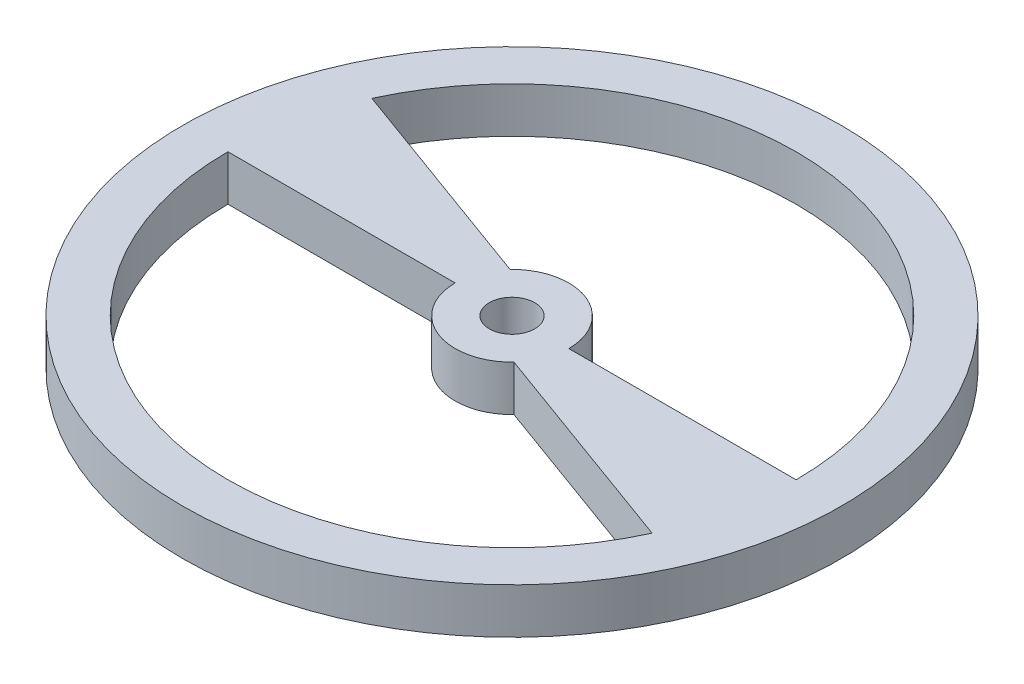
ISO-10303-21;
HEADER;
FILE_DESCRIPTION(('STEP AP214'),'2;1');
FILE_NAME('part.step','',(''),(''),'','','');
FILE_SCHEMA(('AUTOMOTIVE_DESIGN { 1 0 10303 214 1 1 1 1 }'));
ENDSEC;
DATA;
#1=APPLICATION_CONTEXT('core data for automotive mechanical design processes');
#2=APPLICATION_PROTOCOL_DEFINITION('international standard','automotive_design',2000,#1);
#3=PRODUCT_CONTEXT('',#1,'mechanical');
#4=PRODUCT('Part','Part','',(#3));
#5=PRODUCT_RELATED_PRODUCT_CATEGORY('part','',(#4));
#6=PRODUCT_DEFINITION_FORMATION('','',#4);
#7=PRODUCT_DEFINITION_CONTEXT('part definition',#1,'design');
#8=PRODUCT_DEFINITION('design','',#6,#7);
#9=PRODUCT_DEFINITION_SHAPE('','',#8);
#10=(LENGTH_UNIT() NAMED_UNIT(*) SI_UNIT(.MILLI.,.METRE.));
#11=(NAMED_UNIT(*) PLANE_ANGLE_UNIT() SI_UNIT($,.RADIAN.));
#12=(NAMED_UNIT(*) SI_UNIT($,.STERADIAN.) SOLID_ANGLE_UNIT());
#13=UNCERTAINTY_MEASURE_WITH_UNIT(LENGTH_MEASURE(1.E-05),#10,'distance_accuracy_value','');
#14=(GEOMETRIC_REPRESENTATION_CONTEXT(3) GLOBAL_UNCERTAINTY_ASSIGNED_CONTEXT((#13)) GLOBAL_UNIT_ASSIGNED_CONTEXT((#10,
#11,#12)) REPRESENTATION_CONTEXT('',''));
#15=CARTESIAN_POINT('',(0.,0.,0.));
#16=DIRECTION('',(0.,0.,1.));
#17=DIRECTION('',(1.,0.,0.));
#18=AXIS2_PLACEMENT_3D('',#15,#16,#17);
#19=CARTESIAN_POINT('',(0.,2.,0.));
#20=DIRECTION('',(0.,1.,0.));
#21=DIRECTION('',(0.,0.,1.));
#22=AXIS2_PLACEMENT_3D('',#19,#20,#21);
#23=PLANE('',#22);
#24=CARTESIAN_POINT('',(0.,2.,0.));
#25=DIRECTION('',(0.,1.,0.));
#26=DIRECTION('',(0.,0.,1.));
#27=AXIS2_PLACEMENT_3D('',#24,#25,#26);
#28=CIRCLE('',#27,14.5);
#29=CARTESIAN_POINT('',(0.,2.,14.5));
#30=VERTEX_POINT('',#29);
#31=EDGE_CURVE('E11',#30,#30,#28,.T.);
#32=ORIENTED_EDGE('',*,*,#31,.T.);
#33=EDGE_LOOP('',(#32));
#34=FACE_BOUND('',#33,.T.);
#35=CARTESIAN_POINT('',(0.,2.,0.));
#36=DIRECTION('',(0.,1.,0.));
#37=DIRECTION('',(0.,0.,1.));
#38=AXIS2_PLACEMENT_3D('',#35,#36,#37);
#39=CIRCLE('',#38,1.);
#40=CARTESIAN_POINT('',(0.,2.,1.));
#41=VERTEX_POINT('',#40);
#42=EDGE_CURVE('E171',#41,#41,#39,.T.);
#43=ORIENTED_EDGE('',*,*,#42,.F.);
#44=EDGE_LOOP('',(#43));
#45=FACE_BOUND('',#44,.T.);
#46=DIRECTION('',(-1.,0.,0.));
#47=VECTOR('',#46,1.);
#48=CARTESIAN_POINT('',(-2.5,2.,0.));
#49=LINE('',#48,#47);
#50=CARTESIAN_POINT('',(-2.5,2.,0.));
#51=VERTEX_POINT('',#50);
#52=CARTESIAN_POINT('',(-12.5,2.,0.));
#53=VERTEX_POINT('',#52);
#54=EDGE_CURVE('E142',#51,#53,#49,.T.);
#55=ORIENTED_EDGE('',*,*,#54,.F.);
#56=CARTESIAN_POINT('',(0.,2.,0.));
#57=DIRECTION('',(0.,-1.,0.));
#58=DIRECTION('',(0.,0.,1.));
#59=AXIS2_PLACEMENT_3D('',#56,#57,#58);
#60=CIRCLE('',#59,2.5);
#61=CARTESIAN_POINT('',(1.81108613904576,2.,1.72335921878067));
#62=VERTEX_POINT('',#61);
#63=EDGE_CURVE('E140',#62,#51,#60,.T.);
#64=ORIENTED_EDGE('',*,*,#63,.F.);
#65=DIRECTION('',(-0.939692620785908,0.,-0.342020143325669));
#66=VECTOR('',#65,1.);
#67=CARTESIAN_POINT('',(1.81108613904576,2.,1.72335921878067));
#68=LINE('',#67,#66);
#69=CARTESIAN_POINT('',(11.3664895781167,2.,5.20124164700741));
#70=VERTEX_POINT('',#69);
#71=EDGE_CURVE('E148',#70,#62,#68,.T.);
#72=ORIENTED_EDGE('',*,*,#71,.F.);
#73=CARTESIAN_POINT('',(0.,2.,0.));
#74=DIRECTION('',(0.,1.,0.));
#75=DIRECTION('',(0.,0.,1.));
#76=AXIS2_PLACEMENT_3D('',#73,#74,#75);
#77=CIRCLE('',#76,12.5);
#78=EDGE_CURVE('E145',#53,#70,#77,.T.);
#79=ORIENTED_EDGE('',*,*,#78,.F.);
#80=EDGE_LOOP('',(#55,#64,#72,#79));
#81=FACE_BOUND('',#80,.T.);
#82=DIRECTION('',(0.939692620785911,0.,0.342020143325663));
#83=VECTOR('',#82,1.);
#84=CARTESIAN_POINT('',(-11.3664895781167,2.,-5.20124164700733));
#85=LINE('',#84,#83);
#86=CARTESIAN_POINT('',(-11.3664895781167,2.,-5.20124164700733));
#87=VERTEX_POINT('',#86);
#88=CARTESIAN_POINT('',(-1.81108613904577,2.,-1.72335921878066));
#89=VERTEX_POINT('',#88);
#90=EDGE_CURVE('E112',#87,#89,#85,.T.);
#91=ORIENTED_EDGE('',*,*,#90,.F.);
#92=CARTESIAN_POINT('',(0.,2.,0.));
#93=DIRECTION('',(0.,1.,0.));
#94=DIRECTION('',(0.,0.,1.));
#95=AXIS2_PLACEMENT_3D('',#92,#93,#94);
#96=CIRCLE('',#95,12.5);
#97=CARTESIAN_POINT('',(12.5,2.,0.));
#98=VERTEX_POINT('',#97);
#99=EDGE_CURVE('E104',#98,#87,#96,.T.);
#100=ORIENTED_EDGE('',*,*,#99,.F.);
#101=DIRECTION('',(1.,0.,0.));
#102=VECTOR('',#101,1.);
#103=CARTESIAN_POINT('',(2.5,2.,0.));
#104=LINE('',#103,#102);
#105=CARTESIAN_POINT('',(2.5,2.,0.));
#106=VERTEX_POINT('',#105);
#107=EDGE_CURVE('E126',#106,#98,#104,.T.);
#108=ORIENTED_EDGE('',*,*,#107,.F.);
#109=CARTESIAN_POINT('',(0.,2.,0.));
#110=DIRECTION('',(0.,-1.,0.));
#111=DIRECTION('',(0.,0.,1.));
#112=AXIS2_PLACEMENT_3D('',#109,#110,#111);
#113=CIRCLE('',#112,2.5);
#114=EDGE_CURVE('E124',#89,#106,#113,.T.);
#115=ORIENTED_EDGE('',*,*,#114,.F.);
#116=EDGE_LOOP('',(#91,#100,#108,#115));
#117=FACE_BOUND('',#116,.T.);
#118=ADVANCED_FACE('F39',(#34,#45,#81,#117),#23,.T.);
#119=CARTESIAN_POINT('',(0.,0.,0.));
#120=DIRECTION('',(0.,1.,0.));
#121=DIRECTION('',(0.,0.,1.));
#122=AXIS2_PLACEMENT_3D('',#119,#120,#121);
#123=PLANE('',#122);
#124=CARTESIAN_POINT('',(0.,0.,0.));
#125=DIRECTION('',(0.,-1.,0.));
#126=DIRECTION('',(0.,0.,1.));
#127=AXIS2_PLACEMENT_3D('',#124,#125,#126);
#128=CIRCLE('',#127,2.5);
#129=CARTESIAN_POINT('',(1.81108613904576,0.,1.72335921878067));
#130=VERTEX_POINT('',#129);
#131=CARTESIAN_POINT('',(-2.5,0.,0.));
#132=VERTEX_POINT('',#131);
#133=EDGE_CURVE('E120',#130,#132,#128,.T.);
#134=ORIENTED_EDGE('',*,*,#133,.T.);
#135=DIRECTION('',(-1.,0.,0.));
#136=VECTOR('',#135,1.);
#137=CARTESIAN_POINT('',(-2.5,0.,0.));
#138=LINE('',#137,#136);
#139=CARTESIAN_POINT('',(-12.5,0.,0.));
#140=VERTEX_POINT('',#139);
#141=EDGE_CURVE('E153',#132,#140,#138,.T.);
#142=ORIENTED_EDGE('',*,*,#141,.T.);
#143=CARTESIAN_POINT('',(0.,0.,0.));
#144=DIRECTION('',(0.,1.,0.));
#145=DIRECTION('',(0.,0.,1.));
#146=AXIS2_PLACEMENT_3D('',#143,#144,#145);
#147=CIRCLE('',#146,12.5);
#148=CARTESIAN_POINT('',(11.3664895781167,0.,5.2012416470074));
#149=VERTEX_POINT('',#148);
#150=EDGE_CURVE('E156',#140,#149,#147,.T.);
#151=ORIENTED_EDGE('',*,*,#150,.T.);
#152=DIRECTION('',(-0.939692620785908,0.,-0.342020143325669));
#153=VECTOR('',#152,1.);
#154=CARTESIAN_POINT('',(1.81108613904576,0.,1.72335921878067));
#155=LINE('',#154,#153);
#156=EDGE_CURVE('E143',#149,#130,#155,.T.);
#157=ORIENTED_EDGE('',*,*,#156,.T.);
#158=EDGE_LOOP('',(#134,#142,#151,#157));
#159=FACE_BOUND('',#158,.T.);
#160=CARTESIAN_POINT('',(0.,0.,0.));
#161=DIRECTION('',(0.,1.,0.));
#162=DIRECTION('',(0.,0.,1.));
#163=AXIS2_PLACEMENT_3D('',#160,#161,#162);
#164=CIRCLE('',#163,14.5);
#165=CARTESIAN_POINT('',(0.,0.,14.5));
#166=VERTEX_POINT('',#165);
#167=EDGE_CURVE('E43',#166,#166,#164,.T.);
#168=ORIENTED_EDGE('',*,*,#167,.F.);
#169=EDGE_LOOP('',(#168));
#170=FACE_BOUND('',#169,.T.);
#171=CARTESIAN_POINT('',(0.,0.,0.));
#172=DIRECTION('',(0.,1.,0.));
#173=DIRECTION('',(0.,0.,1.));
#174=AXIS2_PLACEMENT_3D('',#171,#172,#173);
#175=CIRCLE('',#174,1.);
#176=CARTESIAN_POINT('',(0.,0.,1.));
#177=VERTEX_POINT('',#176);
#178=EDGE_CURVE('E170',#177,#177,#175,.T.);
#179=ORIENTED_EDGE('',*,*,#178,.T.);
#180=EDGE_LOOP('',(#179));
#181=FACE_BOUND('',#180,.T.);
#182=CARTESIAN_POINT('',(0.,0.,0.));
#183=DIRECTION('',(0.,1.,0.));
#184=DIRECTION('',(0.,0.,1.));
#185=AXIS2_PLACEMENT_3D('',#182,#183,#184);
#186=CIRCLE('',#185,12.5);
#187=CARTESIAN_POINT('',(12.5,0.,0.));
#188=VERTEX_POINT('',#187);
#189=CARTESIAN_POINT('',(-11.3664895781167,0.,-5.20124164700733));
#190=VERTEX_POINT('',#189);
#191=EDGE_CURVE('E62',#188,#190,#186,.T.);
#192=ORIENTED_EDGE('',*,*,#191,.T.);
#193=DIRECTION('',(0.939692620785911,0.,0.342020143325663));
#194=VECTOR('',#193,1.);
#195=CARTESIAN_POINT('',(-11.3664895781167,0.,-5.20124164700733));
#196=LINE('',#195,#194);
#197=CARTESIAN_POINT('',(-1.81108613904577,0.,-1.72335921878066));
#198=VERTEX_POINT('',#197);
#199=EDGE_CURVE('E119',#190,#198,#196,.T.);
#200=ORIENTED_EDGE('',*,*,#199,.T.);
#201=CARTESIAN_POINT('',(0.,0.,0.));
#202=DIRECTION('',(0.,-1.,0.));
#203=DIRECTION('',(0.,0.,1.));
#204=AXIS2_PLACEMENT_3D('',#201,#202,#203);
#205=CIRCLE('',#204,2.5);
#206=CARTESIAN_POINT('',(2.5,0.,0.));
#207=VERTEX_POINT('',#206);
#208=EDGE_CURVE('E132',#198,#207,#205,.T.);
#209=ORIENTED_EDGE('',*,*,#208,.T.);
#210=DIRECTION('',(1.,0.,0.));
#211=VECTOR('',#210,1.);
#212=CARTESIAN_POINT('',(2.5,0.,0.));
#213=LINE('',#212,#211);
#214=EDGE_CURVE('E113',#207,#188,#213,.T.);
#215=ORIENTED_EDGE('',*,*,#214,.T.);
#216=EDGE_LOOP('',(#192,#200,#209,#215));
#217=FACE_BOUND('',#216,.T.);
#218=ADVANCED_FACE('F177',(#159,#170,#181,#217),#123,.F.);
#219=CARTESIAN_POINT('',(0.,2.,0.));
#220=DIRECTION('',(0.,-1.,0.));
#221=DIRECTION('',(0.,0.,-1.));
#222=AXIS2_PLACEMENT_3D('',#219,#220,#221);
#223=CYLINDRICAL_SURFACE('',#222,14.5);
#224=ORIENTED_EDGE('',*,*,#31,.F.);
#225=EDGE_LOOP('',(#224));
#226=FACE_BOUND('',#225,.T.);
#227=ORIENTED_EDGE('',*,*,#167,.T.);
#228=EDGE_LOOP('',(#227));
#229=FACE_BOUND('',#228,.T.);
#230=ADVANCED_FACE('F41',(#226,#229),#223,.T.);
#231=CARTESIAN_POINT('',(0.,2.,0.));
#232=DIRECTION('',(0.,-1.,0.));
#233=DIRECTION('',(0.,0.,-1.));
#234=AXIS2_PLACEMENT_3D('',#231,#232,#233);
#235=CYLINDRICAL_SURFACE('',#234,1.);
#236=ORIENTED_EDGE('',*,*,#42,.T.);
#237=EDGE_LOOP('',(#236));
#238=FACE_BOUND('',#237,.T.);
#239=ORIENTED_EDGE('',*,*,#178,.F.);
#240=EDGE_LOOP('',(#239));
#241=FACE_BOUND('',#240,.T.);
#242=ADVANCED_FACE('F180',(#238,#241),#235,.F.);
#243=CARTESIAN_POINT('',(0.,2.,0.));
#244=DIRECTION('',(0.,-1.,0.));
#245=DIRECTION('',(0.,0.,-1.));
#246=AXIS2_PLACEMENT_3D('',#243,#244,#245);
#247=CYLINDRICAL_SURFACE('',#246,2.5);
#248=ORIENTED_EDGE('',*,*,#133,.F.);
#249=DIRECTION('',(0.,-1.,0.));
#250=VECTOR('',#249,1.);
#251=CARTESIAN_POINT('',(1.81108613904576,2.,1.72335921878067));
#252=LINE('',#251,#250);
#253=EDGE_CURVE('E150',#62,#130,#252,.T.);
#254=ORIENTED_EDGE('',*,*,#253,.F.);
#255=ORIENTED_EDGE('',*,*,#63,.T.);
#256=DIRECTION('',(0.,-1.,0.));
#257=VECTOR('',#256,1.);
#258=CARTESIAN_POINT('',(-2.5,2.,0.));
#259=LINE('',#258,#257);
#260=EDGE_CURVE('E167',#51,#132,#259,.T.);
#261=ORIENTED_EDGE('',*,*,#260,.T.);
#262=EDGE_LOOP('',(#248,#254,#255,#261));
#263=FACE_BOUND('',#262,.T.);
#264=ADVANCED_FACE('F182',(#263),#247,.T.);
#265=CARTESIAN_POINT('',(-2.5,2.,0.));
#266=DIRECTION('',(0.,0.,1.));
#267=DIRECTION('',(1.,0.,0.));
#268=AXIS2_PLACEMENT_3D('',#265,#266,#267);
#269=PLANE('',#268);
#270=ORIENTED_EDGE('',*,*,#141,.F.);
#271=ORIENTED_EDGE('',*,*,#260,.F.);
#272=ORIENTED_EDGE('',*,*,#54,.T.);
#273=DIRECTION('',(0.,-1.,0.));
#274=VECTOR('',#273,1.);
#275=CARTESIAN_POINT('',(-12.5,2.,0.));
#276=LINE('',#275,#274);
#277=EDGE_CURVE('E165',#53,#140,#276,.T.);
#278=ORIENTED_EDGE('',*,*,#277,.T.);
#279=EDGE_LOOP('',(#270,#271,#272,#278));
#280=FACE_BOUND('',#279,.T.);
#281=ADVANCED_FACE('F189',(#280),#269,.T.);
#282=CARTESIAN_POINT('',(0.,2.,0.));
#283=DIRECTION('',(0.,-1.,0.));
#284=DIRECTION('',(0.,0.,-1.));
#285=AXIS2_PLACEMENT_3D('',#282,#283,#284);
#286=CYLINDRICAL_SURFACE('',#285,12.5);
#287=ORIENTED_EDGE('',*,*,#150,.F.);
#288=ORIENTED_EDGE('',*,*,#277,.F.);
#289=ORIENTED_EDGE('',*,*,#78,.T.);
#290=DIRECTION('',(0.,-1.,0.));
#291=VECTOR('',#290,1.);
#292=CARTESIAN_POINT('',(11.3664895781167,2.,5.2012416470074));
#293=LINE('',#292,#291);
#294=EDGE_CURVE('E163',#70,#149,#293,.T.);
#295=ORIENTED_EDGE('',*,*,#294,.T.);
#296=EDGE_LOOP('',(#287,#288,#289,#295));
#297=FACE_BOUND('',#296,.T.);
#298=ADVANCED_FACE('F213',(#297),#286,.F.);
#299=CARTESIAN_POINT('',(1.81108613904576,2.,1.72335921878067));
#300=DIRECTION('',(-0.342020143325669,0.,0.939692620785908));
#301=DIRECTION('',(0.939692620785908,0.,0.342020143325669));
#302=AXIS2_PLACEMENT_3D('',#299,#300,#301);
#303=PLANE('',#302);
#304=ORIENTED_EDGE('',*,*,#156,.F.);
#305=ORIENTED_EDGE('',*,*,#294,.F.);
#306=ORIENTED_EDGE('',*,*,#71,.T.);
#307=ORIENTED_EDGE('',*,*,#253,.T.);
#308=EDGE_LOOP('',(#304,#305,#306,#307));
#309=FACE_BOUND('',#308,.T.);
#310=ADVANCED_FACE('F218',(#309),#303,.T.);
#311=CARTESIAN_POINT('',(0.,2.,0.));
#312=DIRECTION('',(0.,-1.,0.));
#313=DIRECTION('',(0.,0.,-1.));
#314=AXIS2_PLACEMENT_3D('',#311,#312,#313);
#315=CYLINDRICAL_SURFACE('',#314,12.5);
#316=ORIENTED_EDGE('',*,*,#191,.F.);
#317=DIRECTION('',(0.,-1.,0.));
#318=VECTOR('',#317,1.);
#319=CARTESIAN_POINT('',(12.5,2.,0.));
#320=LINE('',#319,#318);
#321=EDGE_CURVE('E108',#98,#188,#320,.T.);
#322=ORIENTED_EDGE('',*,*,#321,.F.);
#323=ORIENTED_EDGE('',*,*,#99,.T.);
#324=DIRECTION('',(0.,-1.,0.));
#325=VECTOR('',#324,1.);
#326=CARTESIAN_POINT('',(-11.3664895781167,2.,-5.20124164700733));
#327=LINE('',#326,#325);
#328=EDGE_CURVE('E107',#87,#190,#327,.T.);
#329=ORIENTED_EDGE('',*,*,#328,.T.);
#330=EDGE_LOOP('',(#316,#322,#323,#329));
#331=FACE_BOUND('',#330,.T.);
#332=ADVANCED_FACE('F106',(#331),#315,.F.);
#333=CARTESIAN_POINT('',(-11.3664895781167,2.,-5.20124164700733));
#334=DIRECTION('',(0.342020143325663,0.,-0.939692620785911));
#335=DIRECTION('',(-0.939692620785911,0.,-0.342020143325663));
#336=AXIS2_PLACEMENT_3D('',#333,#334,#335);
#337=PLANE('',#336);
#338=ORIENTED_EDGE('',*,*,#199,.F.);
#339=ORIENTED_EDGE('',*,*,#328,.F.);
#340=ORIENTED_EDGE('',*,*,#90,.T.);
#341=DIRECTION('',(0.,-1.,0.));
#342=VECTOR('',#341,1.);
#343=CARTESIAN_POINT('',(-1.81108613904577,2.,-1.72335921878066));
#344=LINE('',#343,#342);
#345=EDGE_CURVE('E121',#89,#198,#344,.T.);
#346=ORIENTED_EDGE('',*,*,#345,.T.);
#347=EDGE_LOOP('',(#338,#339,#340,#346));
#348=FACE_BOUND('',#347,.T.);
#349=ADVANCED_FACE('F116',(#348),#337,.T.);
#350=CARTESIAN_POINT('',(0.,2.,0.));
#351=DIRECTION('',(0.,-1.,0.));
#352=DIRECTION('',(0.,0.,-1.));
#353=AXIS2_PLACEMENT_3D('',#350,#351,#352);
#354=CYLINDRICAL_SURFACE('',#353,2.5);
#355=ORIENTED_EDGE('',*,*,#208,.F.);
#356=ORIENTED_EDGE('',*,*,#345,.F.);
#357=ORIENTED_EDGE('',*,*,#114,.T.);
#358=DIRECTION('',(0.,-1.,0.));
#359=VECTOR('',#358,1.);
#360=CARTESIAN_POINT('',(2.5,2.,0.));
#361=LINE('',#360,#359);
#362=EDGE_CURVE('E54',#106,#207,#361,.T.);
#363=ORIENTED_EDGE('',*,*,#362,.T.);
#364=EDGE_LOOP('',(#355,#356,#357,#363));
#365=FACE_BOUND('',#364,.T.);
#366=ADVANCED_FACE('F260',(#365),#354,.T.);
#367=CARTESIAN_POINT('',(2.5,2.,0.));
#368=DIRECTION('',(0.,0.,-1.));
#369=DIRECTION('',(-1.,0.,0.));
#370=AXIS2_PLACEMENT_3D('',#367,#368,#369);
#371=PLANE('',#370);
#372=ORIENTED_EDGE('',*,*,#214,.F.);
#373=ORIENTED_EDGE('',*,*,#362,.F.);
#374=ORIENTED_EDGE('',*,*,#107,.T.);
#375=ORIENTED_EDGE('',*,*,#321,.T.);
#376=EDGE_LOOP('',(#372,#373,#374,#375));
#377=FACE_BOUND('',#376,.T.);
#378=ADVANCED_FACE('F269',(#377),#371,.T.);
#379=CLOSED_SHELL('',(#118,#218,#230,#242,#264,#281,#298,#310,#332,#349,#366,#378));
#380=MANIFOLD_SOLID_BREP('B2',#379);
#381=ADVANCED_BREP_SHAPE_REPRESENTATION('',(#18,#380),#14);
#382=SHAPE_DEFINITION_REPRESENTATION(#9,#381);
ENDSEC;
END-ISO-10303-21;
